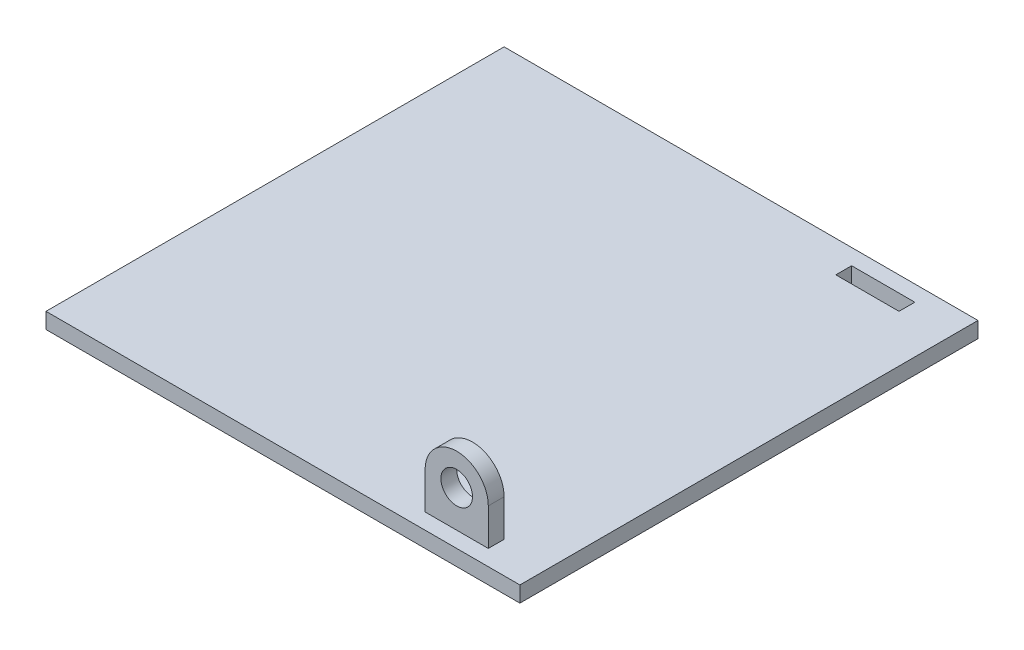
ISO-10303-21;
HEADER;
FILE_DESCRIPTION(('STEP AP214'),'2;1');
FILE_NAME('part.step','',(''),(''),'','','');
FILE_SCHEMA(('AUTOMOTIVE_DESIGN { 1 0 10303 214 1 1 1 1 }'));
ENDSEC;
DATA;
#1=APPLICATION_CONTEXT('core data for automotive mechanical design processes');
#2=APPLICATION_PROTOCOL_DEFINITION('international standard','automotive_design',2000,#1);
#3=PRODUCT_CONTEXT('',#1,'mechanical');
#4=PRODUCT('Part','Part','',(#3));
#5=PRODUCT_RELATED_PRODUCT_CATEGORY('part','',(#4));
#6=PRODUCT_DEFINITION_FORMATION('','',#4);
#7=PRODUCT_DEFINITION_CONTEXT('part definition',#1,'design');
#8=PRODUCT_DEFINITION('design','',#6,#7);
#9=PRODUCT_DEFINITION_SHAPE('','',#8);
#10=(LENGTH_UNIT() NAMED_UNIT(*) SI_UNIT(.MILLI.,.METRE.));
#11=(NAMED_UNIT(*) PLANE_ANGLE_UNIT() SI_UNIT($,.RADIAN.));
#12=(NAMED_UNIT(*) SI_UNIT($,.STERADIAN.) SOLID_ANGLE_UNIT());
#13=UNCERTAINTY_MEASURE_WITH_UNIT(LENGTH_MEASURE(1.E-05),#10,'distance_accuracy_value','');
#14=(GEOMETRIC_REPRESENTATION_CONTEXT(3) GLOBAL_UNCERTAINTY_ASSIGNED_CONTEXT((#13)) GLOBAL_UNIT_ASSIGNED_CONTEXT((#10,
#11,#12)) REPRESENTATION_CONTEXT('',''));
#15=CARTESIAN_POINT('',(0.,0.,0.));
#16=DIRECTION('',(0.,0.,1.));
#17=DIRECTION('',(1.,0.,0.));
#18=AXIS2_PLACEMENT_3D('',#15,#16,#17);
#19=CARTESIAN_POINT('',(0.,3.,0.));
#20=DIRECTION('',(0.,-1.,0.));
#21=DIRECTION('',(0.,0.,-1.));
#22=AXIS2_PLACEMENT_3D('',#19,#20,#21);
#23=PLANE('',#22);
#24=DIRECTION('',(0.,0.,1.));
#25=VECTOR('',#24,1.);
#26=CARTESIAN_POINT('',(24.,3.,37.5));
#27=LINE('',#26,#25);
#28=CARTESIAN_POINT('',(24.,3.,37.5));
#29=VERTEX_POINT('',#28);
#30=CARTESIAN_POINT('',(24.,3.,40.5));
#31=VERTEX_POINT('',#30);
#32=EDGE_CURVE('E56',#29,#31,#27,.T.);
#33=ORIENTED_EDGE('',*,*,#32,.F.);
#34=DIRECTION('',(1.,0.,0.));
#35=VECTOR('',#34,1.);
#36=CARTESIAN_POINT('',(24.,3.,37.5));
#37=LINE('',#36,#35);
#38=CARTESIAN_POINT('',(36.,3.,37.5));
#39=VERTEX_POINT('',#38);
#40=EDGE_CURVE('E60',#29,#39,#37,.T.);
#41=ORIENTED_EDGE('',*,*,#40,.T.);
#42=DIRECTION('',(0.,0.,1.));
#43=VECTOR('',#42,1.);
#44=CARTESIAN_POINT('',(36.,3.,37.5));
#45=LINE('',#44,#43);
#46=CARTESIAN_POINT('',(36.,3.,40.5));
#47=VERTEX_POINT('',#46);
#48=EDGE_CURVE('E140',#39,#47,#45,.T.);
#49=ORIENTED_EDGE('',*,*,#48,.T.);
#50=DIRECTION('',(1.,0.,0.));
#51=VECTOR('',#50,1.);
#52=CARTESIAN_POINT('',(24.,3.,40.5));
#53=LINE('',#52,#51);
#54=EDGE_CURVE('E156',#31,#47,#53,.T.);
#55=ORIENTED_EDGE('',*,*,#54,.F.);
#56=EDGE_LOOP('',(#33,#41,#49,#55));
#57=FACE_BOUND('',#56,.T.);
#58=DIRECTION('',(0.,0.,-1.));
#59=VECTOR('',#58,1.);
#60=CARTESIAN_POINT('',(45.,3.,43.5));
#61=LINE('',#60,#59);
#62=CARTESIAN_POINT('',(45.,3.,43.5));
#63=VERTEX_POINT('',#62);
#64=CARTESIAN_POINT('',(45.,3.,-43.5));
#65=VERTEX_POINT('',#64);
#66=EDGE_CURVE('E200',#63,#65,#61,.T.);
#67=ORIENTED_EDGE('',*,*,#66,.T.);
#68=DIRECTION('',(-1.,0.,0.));
#69=VECTOR('',#68,1.);
#70=CARTESIAN_POINT('',(-45.,3.,-43.5));
#71=LINE('',#70,#69);
#72=CARTESIAN_POINT('',(-45.,3.,-43.5));
#73=VERTEX_POINT('',#72);
#74=EDGE_CURVE('E203',#65,#73,#71,.T.);
#75=ORIENTED_EDGE('',*,*,#74,.T.);
#76=DIRECTION('',(0.,0.,1.));
#77=VECTOR('',#76,1.);
#78=CARTESIAN_POINT('',(-45.,3.,43.5));
#79=LINE('',#78,#77);
#80=CARTESIAN_POINT('',(-45.,3.,43.5));
#81=VERTEX_POINT('',#80);
#82=EDGE_CURVE('E206',#73,#81,#79,.T.);
#83=ORIENTED_EDGE('',*,*,#82,.T.);
#84=DIRECTION('',(1.,0.,0.));
#85=VECTOR('',#84,1.);
#86=CARTESIAN_POINT('',(-45.,3.,43.5));
#87=LINE('',#86,#85);
#88=EDGE_CURVE('E208',#81,#63,#87,.T.);
#89=ORIENTED_EDGE('',*,*,#88,.T.);
#90=EDGE_LOOP('',(#67,#75,#83,#89));
#91=FACE_BOUND('',#90,.T.);
#92=DIRECTION('',(0.,0.,1.));
#93=VECTOR('',#92,1.);
#94=CARTESIAN_POINT('',(24.,3.,-40.5));
#95=LINE('',#94,#93);
#96=CARTESIAN_POINT('',(24.,3.,-40.5));
#97=VERTEX_POINT('',#96);
#98=CARTESIAN_POINT('',(24.,3.,-37.5));
#99=VERTEX_POINT('',#98);
#100=EDGE_CURVE('E169',#97,#99,#95,.T.);
#101=ORIENTED_EDGE('',*,*,#100,.F.);
#102=DIRECTION('',(-1.,0.,0.));
#103=VECTOR('',#102,1.);
#104=CARTESIAN_POINT('',(24.,3.,-40.5));
#105=LINE('',#104,#103);
#106=CARTESIAN_POINT('',(36.,3.,-40.5));
#107=VERTEX_POINT('',#106);
#108=EDGE_CURVE('E177',#107,#97,#105,.T.);
#109=ORIENTED_EDGE('',*,*,#108,.F.);
#110=DIRECTION('',(0.,0.,-1.));
#111=VECTOR('',#110,1.);
#112=CARTESIAN_POINT('',(36.,3.,-40.5));
#113=LINE('',#112,#111);
#114=CARTESIAN_POINT('',(36.,3.,-37.5));
#115=VERTEX_POINT('',#114);
#116=EDGE_CURVE('E174',#115,#107,#113,.T.);
#117=ORIENTED_EDGE('',*,*,#116,.F.);
#118=DIRECTION('',(1.,0.,0.));
#119=VECTOR('',#118,1.);
#120=CARTESIAN_POINT('',(24.,3.,-37.5));
#121=LINE('',#120,#119);
#122=EDGE_CURVE('E171',#99,#115,#121,.T.);
#123=ORIENTED_EDGE('',*,*,#122,.F.);
#124=EDGE_LOOP('',(#101,#109,#117,#123));
#125=FACE_BOUND('',#124,.T.);
#126=ADVANCED_FACE('F41',(#57,#91,#125),#23,.F.);
#127=CARTESIAN_POINT('',(0.,0.,0.));
#128=DIRECTION('',(0.,-1.,0.));
#129=DIRECTION('',(0.,0.,-1.));
#130=AXIS2_PLACEMENT_3D('',#127,#128,#129);
#131=PLANE('',#130);
#132=DIRECTION('',(0.,0.,-1.));
#133=VECTOR('',#132,1.);
#134=CARTESIAN_POINT('',(45.,0.,43.5));
#135=LINE('',#134,#133);
#136=CARTESIAN_POINT('',(45.,0.,43.5));
#137=VERTEX_POINT('',#136);
#138=CARTESIAN_POINT('',(45.,0.,-43.5));
#139=VERTEX_POINT('',#138);
#140=EDGE_CURVE('E199',#137,#139,#135,.T.);
#141=ORIENTED_EDGE('',*,*,#140,.F.);
#142=DIRECTION('',(1.,0.,0.));
#143=VECTOR('',#142,1.);
#144=CARTESIAN_POINT('',(-45.,0.,43.5));
#145=LINE('',#144,#143);
#146=CARTESIAN_POINT('',(-45.,0.,43.5));
#147=VERTEX_POINT('',#146);
#148=EDGE_CURVE('E204',#147,#137,#145,.T.);
#149=ORIENTED_EDGE('',*,*,#148,.F.);
#150=DIRECTION('',(0.,0.,1.));
#151=VECTOR('',#150,1.);
#152=CARTESIAN_POINT('',(-45.,0.,43.5));
#153=LINE('',#152,#151);
#154=CARTESIAN_POINT('',(-45.,0.,-43.5));
#155=VERTEX_POINT('',#154);
#156=EDGE_CURVE('E215',#155,#147,#153,.T.);
#157=ORIENTED_EDGE('',*,*,#156,.F.);
#158=DIRECTION('',(-1.,0.,0.));
#159=VECTOR('',#158,1.);
#160=CARTESIAN_POINT('',(-45.,0.,-43.5));
#161=LINE('',#160,#159);
#162=EDGE_CURVE('E213',#139,#155,#161,.T.);
#163=ORIENTED_EDGE('',*,*,#162,.F.);
#164=EDGE_LOOP('',(#141,#149,#157,#163));
#165=FACE_BOUND('',#164,.T.);
#166=DIRECTION('',(-1.,0.,0.));
#167=VECTOR('',#166,1.);
#168=CARTESIAN_POINT('',(24.,0.,-40.5));
#169=LINE('',#168,#167);
#170=CARTESIAN_POINT('',(36.,0.,-40.5));
#171=VERTEX_POINT('',#170);
#172=CARTESIAN_POINT('',(24.,0.,-40.5));
#173=VERTEX_POINT('',#172);
#174=EDGE_CURVE('E172',#171,#173,#169,.T.);
#175=ORIENTED_EDGE('',*,*,#174,.T.);
#176=DIRECTION('',(0.,0.,1.));
#177=VECTOR('',#176,1.);
#178=CARTESIAN_POINT('',(24.,0.,-40.5));
#179=LINE('',#178,#177);
#180=CARTESIAN_POINT('',(24.,0.,-37.5));
#181=VERTEX_POINT('',#180);
#182=EDGE_CURVE('E166',#173,#181,#179,.T.);
#183=ORIENTED_EDGE('',*,*,#182,.T.);
#184=DIRECTION('',(1.,0.,0.));
#185=VECTOR('',#184,1.);
#186=CARTESIAN_POINT('',(24.,0.,-37.5));
#187=LINE('',#186,#185);
#188=CARTESIAN_POINT('',(36.,0.,-37.5));
#189=VERTEX_POINT('',#188);
#190=EDGE_CURVE('E182',#181,#189,#187,.T.);
#191=ORIENTED_EDGE('',*,*,#190,.T.);
#192=DIRECTION('',(0.,0.,-1.));
#193=VECTOR('',#192,1.);
#194=CARTESIAN_POINT('',(36.,0.,-40.5));
#195=LINE('',#194,#193);
#196=EDGE_CURVE('E185',#189,#171,#195,.T.);
#197=ORIENTED_EDGE('',*,*,#196,.T.);
#198=EDGE_LOOP('',(#175,#183,#191,#197));
#199=FACE_BOUND('',#198,.T.);
#200=ADVANCED_FACE('F233',(#165,#199),#131,.T.);
#201=CARTESIAN_POINT('',(45.,3.,43.5));
#202=DIRECTION('',(-1.,0.,0.));
#203=DIRECTION('',(0.,0.,1.));
#204=AXIS2_PLACEMENT_3D('',#201,#202,#203);
#205=PLANE('',#204);
#206=ORIENTED_EDGE('',*,*,#140,.T.);
#207=DIRECTION('',(0.,-1.,0.));
#208=VECTOR('',#207,1.);
#209=CARTESIAN_POINT('',(45.,3.,-43.5));
#210=LINE('',#209,#208);
#211=EDGE_CURVE('E11',#65,#139,#210,.T.);
#212=ORIENTED_EDGE('',*,*,#211,.F.);
#213=ORIENTED_EDGE('',*,*,#66,.F.);
#214=DIRECTION('',(0.,-1.,0.));
#215=VECTOR('',#214,1.);
#216=CARTESIAN_POINT('',(45.,3.,43.5));
#217=LINE('',#216,#215);
#218=EDGE_CURVE('E210',#63,#137,#217,.T.);
#219=ORIENTED_EDGE('',*,*,#218,.T.);
#220=EDGE_LOOP('',(#206,#212,#213,#219));
#221=FACE_BOUND('',#220,.T.);
#222=ADVANCED_FACE('F43',(#221),#205,.F.);
#223=CARTESIAN_POINT('',(-45.,3.,-43.5));
#224=DIRECTION('',(0.,0.,1.));
#225=DIRECTION('',(1.,0.,0.));
#226=AXIS2_PLACEMENT_3D('',#223,#224,#225);
#227=PLANE('',#226);
#228=ORIENTED_EDGE('',*,*,#162,.T.);
#229=DIRECTION('',(0.,-1.,0.));
#230=VECTOR('',#229,1.);
#231=CARTESIAN_POINT('',(-45.,3.,-43.5));
#232=LINE('',#231,#230);
#233=EDGE_CURVE('E49',#73,#155,#232,.T.);
#234=ORIENTED_EDGE('',*,*,#233,.F.);
#235=ORIENTED_EDGE('',*,*,#74,.F.);
#236=ORIENTED_EDGE('',*,*,#211,.T.);
#237=EDGE_LOOP('',(#228,#234,#235,#236));
#238=FACE_BOUND('',#237,.T.);
#239=ADVANCED_FACE('F244',(#238),#227,.F.);
#240=CARTESIAN_POINT('',(-45.,3.,43.5));
#241=DIRECTION('',(1.,0.,0.));
#242=DIRECTION('',(0.,0.,-1.));
#243=AXIS2_PLACEMENT_3D('',#240,#241,#242);
#244=PLANE('',#243);
#245=ORIENTED_EDGE('',*,*,#156,.T.);
#246=DIRECTION('',(0.,-1.,0.));
#247=VECTOR('',#246,1.);
#248=CARTESIAN_POINT('',(-45.,3.,43.5));
#249=LINE('',#248,#247);
#250=EDGE_CURVE('E220',#81,#147,#249,.T.);
#251=ORIENTED_EDGE('',*,*,#250,.F.);
#252=ORIENTED_EDGE('',*,*,#82,.F.);
#253=ORIENTED_EDGE('',*,*,#233,.T.);
#254=EDGE_LOOP('',(#245,#251,#252,#253));
#255=FACE_BOUND('',#254,.T.);
#256=ADVANCED_FACE('F227',(#255),#244,.F.);
#257=CARTESIAN_POINT('',(-45.,3.,43.5));
#258=DIRECTION('',(0.,0.,-1.));
#259=DIRECTION('',(-1.,0.,0.));
#260=AXIS2_PLACEMENT_3D('',#257,#258,#259);
#261=PLANE('',#260);
#262=ORIENTED_EDGE('',*,*,#148,.T.);
#263=ORIENTED_EDGE('',*,*,#218,.F.);
#264=ORIENTED_EDGE('',*,*,#88,.F.);
#265=ORIENTED_EDGE('',*,*,#250,.T.);
#266=EDGE_LOOP('',(#262,#263,#264,#265));
#267=FACE_BOUND('',#266,.T.);
#268=ADVANCED_FACE('F237',(#267),#261,.F.);
#269=CARTESIAN_POINT('',(24.,3.,-40.5));
#270=DIRECTION('',(1.,0.,0.));
#271=DIRECTION('',(0.,0.,-1.));
#272=AXIS2_PLACEMENT_3D('',#269,#270,#271);
#273=PLANE('',#272);
#274=ORIENTED_EDGE('',*,*,#182,.F.);
#275=DIRECTION('',(0.,-1.,0.));
#276=VECTOR('',#275,1.);
#277=CARTESIAN_POINT('',(24.,3.,-40.5));
#278=LINE('',#277,#276);
#279=EDGE_CURVE('E179',#97,#173,#278,.T.);
#280=ORIENTED_EDGE('',*,*,#279,.F.);
#281=ORIENTED_EDGE('',*,*,#100,.T.);
#282=DIRECTION('',(0.,-1.,0.));
#283=VECTOR('',#282,1.);
#284=CARTESIAN_POINT('',(24.,3.,-37.5));
#285=LINE('',#284,#283);
#286=EDGE_CURVE('E196',#99,#181,#285,.T.);
#287=ORIENTED_EDGE('',*,*,#286,.T.);
#288=EDGE_LOOP('',(#274,#280,#281,#287));
#289=FACE_BOUND('',#288,.T.);
#290=ADVANCED_FACE('F260',(#289),#273,.T.);
#291=CARTESIAN_POINT('',(24.,3.,-37.5));
#292=DIRECTION('',(0.,0.,-1.));
#293=DIRECTION('',(-1.,0.,0.));
#294=AXIS2_PLACEMENT_3D('',#291,#292,#293);
#295=PLANE('',#294);
#296=ORIENTED_EDGE('',*,*,#190,.F.);
#297=ORIENTED_EDGE('',*,*,#286,.F.);
#298=ORIENTED_EDGE('',*,*,#122,.T.);
#299=DIRECTION('',(0.,-1.,0.));
#300=VECTOR('',#299,1.);
#301=CARTESIAN_POINT('',(36.,3.,-37.5));
#302=LINE('',#301,#300);
#303=EDGE_CURVE('E194',#115,#189,#302,.T.);
#304=ORIENTED_EDGE('',*,*,#303,.T.);
#305=EDGE_LOOP('',(#296,#297,#298,#304));
#306=FACE_BOUND('',#305,.T.);
#307=ADVANCED_FACE('F267',(#306),#295,.T.);
#308=CARTESIAN_POINT('',(36.,3.,-40.5));
#309=DIRECTION('',(-1.,0.,0.));
#310=DIRECTION('',(0.,0.,1.));
#311=AXIS2_PLACEMENT_3D('',#308,#309,#310);
#312=PLANE('',#311);
#313=ORIENTED_EDGE('',*,*,#196,.F.);
#314=ORIENTED_EDGE('',*,*,#303,.F.);
#315=ORIENTED_EDGE('',*,*,#116,.T.);
#316=DIRECTION('',(0.,-1.,0.));
#317=VECTOR('',#316,1.);
#318=CARTESIAN_POINT('',(36.,3.,-40.5));
#319=LINE('',#318,#317);
#320=EDGE_CURVE('E192',#107,#171,#319,.T.);
#321=ORIENTED_EDGE('',*,*,#320,.T.);
#322=EDGE_LOOP('',(#313,#314,#315,#321));
#323=FACE_BOUND('',#322,.T.);
#324=ADVANCED_FACE('F272',(#323),#312,.T.);
#325=CARTESIAN_POINT('',(24.,3.,-40.5));
#326=DIRECTION('',(0.,0.,1.));
#327=DIRECTION('',(1.,0.,0.));
#328=AXIS2_PLACEMENT_3D('',#325,#326,#327);
#329=PLANE('',#328);
#330=ORIENTED_EDGE('',*,*,#174,.F.);
#331=ORIENTED_EDGE('',*,*,#320,.F.);
#332=ORIENTED_EDGE('',*,*,#108,.T.);
#333=ORIENTED_EDGE('',*,*,#279,.T.);
#334=EDGE_LOOP('',(#330,#331,#332,#333));
#335=FACE_BOUND('',#334,.T.);
#336=ADVANCED_FACE('F279',(#335),#329,.T.);
#337=CARTESIAN_POINT('',(24.,3.,37.5));
#338=DIRECTION('',(-1.,0.,0.));
#339=DIRECTION('',(0.,0.,1.));
#340=AXIS2_PLACEMENT_3D('',#337,#338,#339);
#341=PLANE('',#340);
#342=DIRECTION('',(0.,-1.,0.));
#343=VECTOR('',#342,1.);
#344=CARTESIAN_POINT('',(24.,3.,40.5));
#345=LINE('',#344,#343);
#346=CARTESIAN_POINT('',(24.,10.,40.5));
#347=VERTEX_POINT('',#346);
#348=EDGE_CURVE('E151',#347,#31,#345,.T.);
#349=ORIENTED_EDGE('',*,*,#348,.F.);
#350=DIRECTION('',(0.,0.,1.));
#351=VECTOR('',#350,1.);
#352=CARTESIAN_POINT('',(24.,10.,37.5));
#353=LINE('',#352,#351);
#354=CARTESIAN_POINT('',(24.,10.,37.5));
#355=VERTEX_POINT('',#354);
#356=EDGE_CURVE('E139',#355,#347,#353,.T.);
#357=ORIENTED_EDGE('',*,*,#356,.F.);
#358=DIRECTION('',(0.,-1.,0.));
#359=VECTOR('',#358,1.);
#360=CARTESIAN_POINT('',(24.,3.,37.5));
#361=LINE('',#360,#359);
#362=EDGE_CURVE('E147',#355,#29,#361,.T.);
#363=ORIENTED_EDGE('',*,*,#362,.T.);
#364=ORIENTED_EDGE('',*,*,#32,.T.);
#365=EDGE_LOOP('',(#349,#357,#363,#364));
#366=FACE_BOUND('',#365,.T.);
#367=ADVANCED_FACE('F290',(#366),#341,.T.);
#368=CARTESIAN_POINT('',(30.,10.,37.5));
#369=DIRECTION('',(0.,0.,1.));
#370=DIRECTION('',(1.,0.,0.));
#371=AXIS2_PLACEMENT_3D('',#368,#369,#370);
#372=CYLINDRICAL_SURFACE('',#371,6.);
#373=CARTESIAN_POINT('',(30.,10.,40.5));
#374=DIRECTION('',(0.,0.,1.));
#375=DIRECTION('',(-1.,0.,0.));
#376=AXIS2_PLACEMENT_3D('',#373,#374,#375);
#377=CIRCLE('',#376,6.);
#378=CARTESIAN_POINT('',(36.,10.,40.5));
#379=VERTEX_POINT('',#378);
#380=EDGE_CURVE('E134',#379,#347,#377,.T.);
#381=ORIENTED_EDGE('',*,*,#380,.F.);
#382=DIRECTION('',(0.,0.,1.));
#383=VECTOR('',#382,1.);
#384=CARTESIAN_POINT('',(36.,10.,37.5));
#385=LINE('',#384,#383);
#386=CARTESIAN_POINT('',(36.,10.,37.5));
#387=VERTEX_POINT('',#386);
#388=EDGE_CURVE('E128',#387,#379,#385,.T.);
#389=ORIENTED_EDGE('',*,*,#388,.F.);
#390=CARTESIAN_POINT('',(30.,10.,37.5));
#391=DIRECTION('',(0.,0.,1.));
#392=DIRECTION('',(-1.,0.,0.));
#393=AXIS2_PLACEMENT_3D('',#390,#391,#392);
#394=CIRCLE('',#393,6.);
#395=EDGE_CURVE('E131',#387,#355,#394,.T.);
#396=ORIENTED_EDGE('',*,*,#395,.T.);
#397=ORIENTED_EDGE('',*,*,#356,.T.);
#398=EDGE_LOOP('',(#381,#389,#396,#397));
#399=FACE_BOUND('',#398,.T.);
#400=ADVANCED_FACE('F130',(#399),#372,.T.);
#401=CARTESIAN_POINT('',(36.,3.,37.5));
#402=DIRECTION('',(1.,0.,0.));
#403=DIRECTION('',(0.,0.,-1.));
#404=AXIS2_PLACEMENT_3D('',#401,#402,#403);
#405=PLANE('',#404);
#406=DIRECTION('',(0.,1.,0.));
#407=VECTOR('',#406,1.);
#408=CARTESIAN_POINT('',(36.,3.,40.5));
#409=LINE('',#408,#407);
#410=EDGE_CURVE('E159',#47,#379,#409,.T.);
#411=ORIENTED_EDGE('',*,*,#410,.F.);
#412=ORIENTED_EDGE('',*,*,#48,.F.);
#413=DIRECTION('',(0.,1.,0.));
#414=VECTOR('',#413,1.);
#415=CARTESIAN_POINT('',(36.,3.,37.5));
#416=LINE('',#415,#414);
#417=EDGE_CURVE('E145',#39,#387,#416,.T.);
#418=ORIENTED_EDGE('',*,*,#417,.T.);
#419=ORIENTED_EDGE('',*,*,#388,.T.);
#420=EDGE_LOOP('',(#411,#412,#418,#419));
#421=FACE_BOUND('',#420,.T.);
#422=ADVANCED_FACE('F149',(#421),#405,.T.);
#423=CARTESIAN_POINT('',(30.,10.,37.5));
#424=DIRECTION('',(0.,0.,-1.));
#425=DIRECTION('',(-1.,0.,0.));
#426=AXIS2_PLACEMENT_3D('',#423,#424,#425);
#427=PLANE('',#426);
#428=CARTESIAN_POINT('',(30.,10.,37.5));
#429=DIRECTION('',(0.,0.,1.));
#430=DIRECTION('',(1.,0.,0.));
#431=AXIS2_PLACEMENT_3D('',#428,#429,#430);
#432=CIRCLE('',#431,2.99999999999999);
#433=CARTESIAN_POINT('',(33.,10.,37.5));
#434=VERTEX_POINT('',#433);
#435=EDGE_CURVE('E160',#434,#434,#432,.T.);
#436=ORIENTED_EDGE('',*,*,#435,.T.);
#437=EDGE_LOOP('',(#436));
#438=FACE_BOUND('',#437,.T.);
#439=ORIENTED_EDGE('',*,*,#40,.F.);
#440=ORIENTED_EDGE('',*,*,#362,.F.);
#441=ORIENTED_EDGE('',*,*,#395,.F.);
#442=ORIENTED_EDGE('',*,*,#417,.F.);
#443=EDGE_LOOP('',(#439,#440,#441,#442));
#444=FACE_BOUND('',#443,.T.);
#445=ADVANCED_FACE('F144',(#438,#444),#427,.T.);
#446=CARTESIAN_POINT('',(30.,10.,40.5));
#447=DIRECTION('',(0.,0.,-1.));
#448=DIRECTION('',(-1.,0.,0.));
#449=AXIS2_PLACEMENT_3D('',#446,#447,#448);
#450=PLANE('',#449);
#451=CARTESIAN_POINT('',(30.,10.,40.5));
#452=DIRECTION('',(0.,0.,1.));
#453=DIRECTION('',(1.,0.,0.));
#454=AXIS2_PLACEMENT_3D('',#451,#452,#453);
#455=CIRCLE('',#454,2.99999999999999);
#456=CARTESIAN_POINT('',(33.,10.,40.5));
#457=VERTEX_POINT('',#456);
#458=EDGE_CURVE('E316',#457,#457,#455,.T.);
#459=ORIENTED_EDGE('',*,*,#458,.F.);
#460=EDGE_LOOP('',(#459));
#461=FACE_BOUND('',#460,.T.);
#462=ORIENTED_EDGE('',*,*,#54,.T.);
#463=ORIENTED_EDGE('',*,*,#410,.T.);
#464=ORIENTED_EDGE('',*,*,#380,.T.);
#465=ORIENTED_EDGE('',*,*,#348,.T.);
#466=EDGE_LOOP('',(#462,#463,#464,#465));
#467=FACE_BOUND('',#466,.T.);
#468=ADVANCED_FACE('F299',(#461,#467),#450,.F.);
#469=CARTESIAN_POINT('',(30.,10.,37.5));
#470=DIRECTION('',(0.,0.,1.));
#471=DIRECTION('',(1.,0.,0.));
#472=AXIS2_PLACEMENT_3D('',#469,#470,#471);
#473=CYLINDRICAL_SURFACE('',#472,2.99999999999999);
#474=ORIENTED_EDGE('',*,*,#435,.F.);
#475=EDGE_LOOP('',(#474));
#476=FACE_BOUND('',#475,.T.);
#477=ORIENTED_EDGE('',*,*,#458,.T.);
#478=EDGE_LOOP('',(#477));
#479=FACE_BOUND('',#478,.T.);
#480=ADVANCED_FACE('F302',(#476,#479),#473,.F.);
#481=CLOSED_SHELL('',(#126,#200,#222,#239,#256,#268,#290,#307,#324,#336,#367,#400,#422,#445,
#468,#480));
#482=MANIFOLD_SOLID_BREP('B2',#481);
#483=ADVANCED_BREP_SHAPE_REPRESENTATION('',(#18,#482),#14);
#484=SHAPE_DEFINITION_REPRESENTATION(#9,#483);
ENDSEC;
END-ISO-10303-21;
